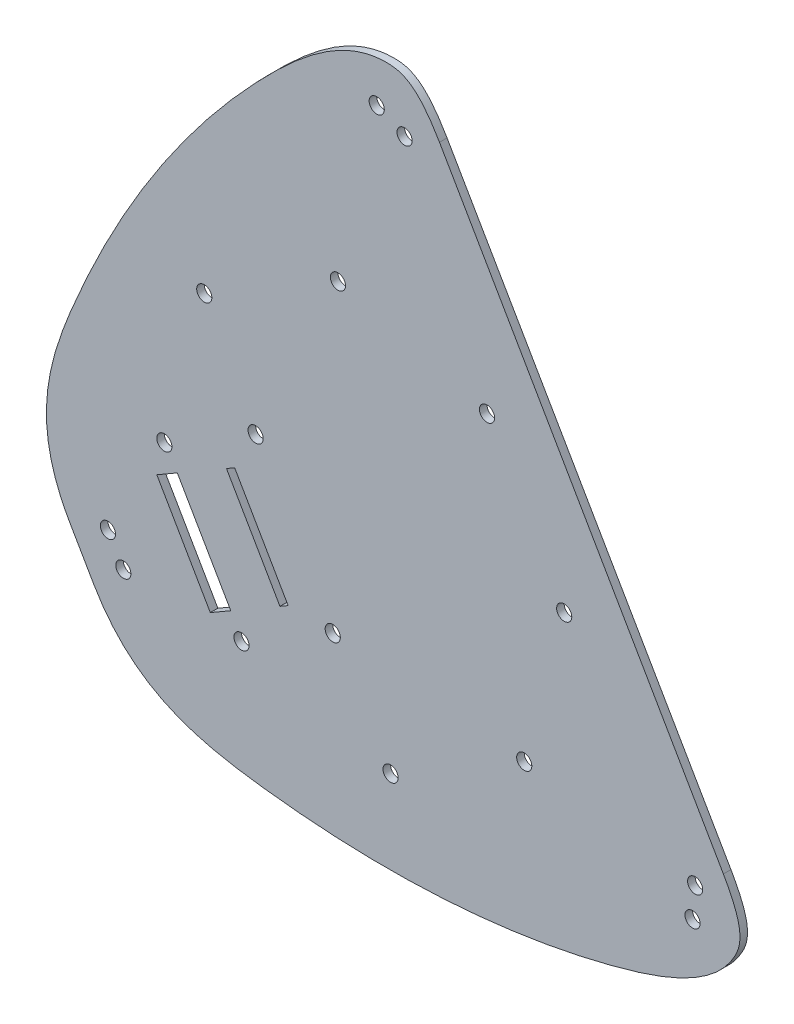
ISO-10303-21;
HEADER;
FILE_DESCRIPTION(('STEP AP214'),'2;1');
FILE_NAME('part.step','',(''),(''),'','','');
FILE_SCHEMA(('AUTOMOTIVE_DESIGN { 1 0 10303 214 1 1 1 1 }'));
ENDSEC;
DATA;
#1=APPLICATION_CONTEXT('core data for automotive mechanical design processes');
#2=APPLICATION_PROTOCOL_DEFINITION('international standard','automotive_design',2000,#1);
#3=PRODUCT_CONTEXT('',#1,'mechanical');
#4=PRODUCT('Part','Part','',(#3));
#5=PRODUCT_RELATED_PRODUCT_CATEGORY('part','',(#4));
#6=PRODUCT_DEFINITION_FORMATION('','',#4);
#7=PRODUCT_DEFINITION_CONTEXT('part definition',#1,'design');
#8=PRODUCT_DEFINITION('design','',#6,#7);
#9=PRODUCT_DEFINITION_SHAPE('','',#8);
#10=(LENGTH_UNIT() NAMED_UNIT(*) SI_UNIT(.MILLI.,.METRE.));
#11=(NAMED_UNIT(*) PLANE_ANGLE_UNIT() SI_UNIT($,.RADIAN.));
#12=(NAMED_UNIT(*) SI_UNIT($,.STERADIAN.) SOLID_ANGLE_UNIT());
#13=UNCERTAINTY_MEASURE_WITH_UNIT(LENGTH_MEASURE(1.E-05),#10,'distance_accuracy_value','');
#14=(GEOMETRIC_REPRESENTATION_CONTEXT(3) GLOBAL_UNCERTAINTY_ASSIGNED_CONTEXT((#13)) GLOBAL_UNIT_ASSIGNED_CONTEXT((#10,
#11,#12)) REPRESENTATION_CONTEXT('',''));
#15=CARTESIAN_POINT('',(0.,0.,0.));
#16=DIRECTION('',(0.,0.,1.));
#17=DIRECTION('',(1.,0.,0.));
#18=AXIS2_PLACEMENT_3D('',#15,#16,#17);
#19=CARTESIAN_POINT('',(-72.5135977928275,27.52250719282,1.6));
#20=DIRECTION('',(0.,0.,-1.));
#21=DIRECTION('',(-1.,0.,0.));
#22=AXIS2_PLACEMENT_3D('',#19,#20,#21);
#23=PLANE('',#22);
#24=CARTESIAN_POINT('',(-36.1038981333848,-39.6662140816864,1.6));
#25=DIRECTION('',(0.,0.,-1.));
#26=DIRECTION('',(-1.,0.,0.));
#27=AXIS2_PLACEMENT_3D('',#24,#25,#26);
#28=CIRCLE('',#27,1.60000000000001);
#29=CARTESIAN_POINT('',(-37.7038981333848,-39.6662140816864,1.6));
#30=VERTEX_POINT('',#29);
#31=EDGE_CURVE('E421',#30,#30,#28,.T.);
#32=ORIENTED_EDGE('',*,*,#31,.T.);
#33=EDGE_LOOP('',(#32));
#34=FACE_BOUND('',#33,.T.);
#35=CARTESIAN_POINT('',(-52.4038981333848,-11.4337859183136,1.6));
#36=DIRECTION('',(0.,0.,-1.));
#37=DIRECTION('',(-1.,0.,0.));
#38=AXIS2_PLACEMENT_3D('',#35,#36,#37);
#39=CIRCLE('',#38,1.6);
#40=CARTESIAN_POINT('',(-54.0038981333848,-11.4337859183136,1.6));
#41=VERTEX_POINT('',#40);
#42=EDGE_CURVE('E426',#41,#41,#39,.T.);
#43=ORIENTED_EDGE('',*,*,#42,.T.);
#44=EDGE_LOOP('',(#43));
#45=FACE_BOUND('',#44,.T.);
#46=DIRECTION('',(-0.866025403784438,-0.500000000000001,0.));
#47=VECTOR('',#46,1.);
#48=CARTESIAN_POINT('',(-61.9865840355647,-48.8360870627642,1.6));
#49=LINE('',#48,#47);
#50=CARTESIAN_POINT('',(-57.6564570166425,-46.3360870627642,1.6));
#51=VERTEX_POINT('',#50);
#52=CARTESIAN_POINT('',(-61.9865840355647,-48.8360870627642,1.6));
#53=VERTEX_POINT('',#52);
#54=EDGE_CURVE('E167',#51,#53,#49,.T.);
#55=ORIENTED_EDGE('',*,*,#54,.T.);
#56=DIRECTION('',(-0.5,0.866025403784439,0.));
#57=VECTOR('',#56,1.);
#58=CARTESIAN_POINT('',(-73.2865840355647,-29.2639129372359,1.6));
#59=LINE('',#58,#57);
#60=CARTESIAN_POINT('',(-73.2865840355647,-29.2639129372359,1.6));
#61=VERTEX_POINT('',#60);
#62=EDGE_CURVE('E190',#53,#61,#59,.T.);
#63=ORIENTED_EDGE('',*,*,#62,.T.);
#64=DIRECTION('',(0.866025403784438,0.5,0.));
#65=VECTOR('',#64,1.);
#66=CARTESIAN_POINT('',(-68.9564570166425,-26.7639129372359,1.6));
#67=LINE('',#66,#65);
#68=CARTESIAN_POINT('',(-68.9564570166425,-26.7639129372359,1.6));
#69=VERTEX_POINT('',#68);
#70=EDGE_CURVE('E132',#61,#69,#67,.T.);
#71=ORIENTED_EDGE('',*,*,#70,.T.);
#72=DIRECTION('',(0.5,-0.866025403784439,0.));
#73=VECTOR('',#72,1.);
#74=CARTESIAN_POINT('',(-57.6564570166425,-46.3360870627642,1.6));
#75=LINE('',#74,#73);
#76=EDGE_CURVE('E164',#69,#51,#75,.T.);
#77=ORIENTED_EDGE('',*,*,#76,.T.);
#78=EDGE_LOOP('',(#55,#63,#71,#77));
#79=FACE_BOUND('',#78,.T.);
#80=CARTESIAN_POINT('',(-23.8818374162525,-59.2553799917519,1.6));
#81=DIRECTION('',(0.,0.,-1.));
#82=DIRECTION('',(-1.,0.,0.));
#83=AXIS2_PLACEMENT_3D('',#80,#81,#82);
#84=CIRCLE('',#83,1.6);
#85=CARTESIAN_POINT('',(-25.4818374162525,-59.2553799917519,1.6));
#86=VERTEX_POINT('',#85);
#87=EDGE_CURVE('E216',#86,#86,#84,.T.);
#88=ORIENTED_EDGE('',*,*,#87,.T.);
#89=EDGE_LOOP('',(#88));
#90=FACE_BOUND('',#89,.T.);
#91=CARTESIAN_POINT('',(-71.700243720423,-22.5630263124186,1.6));
#92=DIRECTION('',(0.,0.,-1.));
#93=DIRECTION('',(-1.,0.,0.));
#94=AXIS2_PLACEMENT_3D('',#91,#92,#93);
#95=CIRCLE('',#94,1.6);
#96=CARTESIAN_POINT('',(-73.300243720423,-22.5630263124186,1.6));
#97=VERTEX_POINT('',#96);
#98=EDGE_CURVE('E222',#97,#97,#95,.T.);
#99=ORIENTED_EDGE('',*,*,#98,.T.);
#100=EDGE_LOOP('',(#99));
#101=FACE_BOUND('',#100,.T.);
#102=CARTESIAN_POINT('',(-63.2575830918835,8.94541210435178,1.6));
#103=DIRECTION('',(0.,0.,-1.));
#104=DIRECTION('',(-1.,0.,0.));
#105=AXIS2_PLACEMENT_3D('',#102,#103,#104);
#106=CIRCLE('',#105,1.6);
#107=CARTESIAN_POINT('',(-64.8575830918836,8.94541210435178,1.6));
#108=VERTEX_POINT('',#107);
#109=EDGE_CURVE('E228',#108,#108,#106,.T.);
#110=ORIENTED_EDGE('',*,*,#109,.T.);
#111=EDGE_LOOP('',(#110));
#112=FACE_BOUND('',#111,.T.);
#113=CARTESIAN_POINT('',(-3.49945162431928,16.8127193632125,1.6));
#114=DIRECTION('',(0.,0.,-1.));
#115=DIRECTION('',(-1.,0.,0.));
#116=AXIS2_PLACEMENT_3D('',#113,#114,#115);
#117=CIRCLE('',#116,1.6);
#118=CARTESIAN_POINT('',(-5.09945162431928,16.8127193632125,1.6));
#119=VERTEX_POINT('',#118);
#120=EDGE_CURVE('E197',#119,#119,#117,.T.);
#121=ORIENTED_EDGE('',*,*,#120,.T.);
#122=EDGE_LOOP('',(#121));
#123=FACE_BOUND('',#122,.T.);
#124=CARTESIAN_POINT('',(-35.0078900410896,25.2553799917519,1.6));
#125=DIRECTION('',(0.,0.,-1.));
#126=DIRECTION('',(-1.,0.,0.));
#127=AXIS2_PLACEMENT_3D('',#124,#125,#126);
#128=CIRCLE('',#127,1.6);
#129=CARTESIAN_POINT('',(-36.6078900410896,25.2553799917519,1.6));
#130=VERTEX_POINT('',#129);
#131=EDGE_CURVE('E198',#130,#130,#128,.T.);
#132=ORIENTED_EDGE('',*,*,#131,.T.);
#133=EDGE_LOOP('',(#132));
#134=FACE_BOUND('',#133,.T.);
#135=CARTESIAN_POINT('',(12.8105162630809,-11.4369736875814,1.6));
#136=DIRECTION('',(0.,0.,-1.));
#137=DIRECTION('',(-1.,0.,0.));
#138=AXIS2_PLACEMENT_3D('',#135,#136,#137);
#139=CIRCLE('',#138,1.6);
#140=CARTESIAN_POINT('',(11.2105162630809,-11.4369736875814,1.6));
#141=VERTEX_POINT('',#140);
#142=EDGE_CURVE('E204',#141,#141,#139,.T.);
#143=ORIENTED_EDGE('',*,*,#142,.T.);
#144=EDGE_LOOP('',(#143));
#145=FACE_BOUND('',#144,.T.);
#146=CARTESIAN_POINT('',(4.36785563454145,-42.9454121043518,1.6));
#147=DIRECTION('',(0.,0.,-1.));
#148=DIRECTION('',(-1.,0.,0.));
#149=AXIS2_PLACEMENT_3D('',#146,#147,#148);
#150=CIRCLE('',#149,1.60000000000001);
#151=CARTESIAN_POINT('',(2.76785563454144,-42.9454121043518,1.6));
#152=VERTEX_POINT('',#151);
#153=EDGE_CURVE('E193',#152,#152,#150,.T.);
#154=ORIENTED_EDGE('',*,*,#153,.T.);
#155=EDGE_LOOP('',(#154));
#156=FACE_BOUND('',#155,.T.);
#157=CARTESIAN_POINT('',(-55.3902758330228,-50.8127193632125,1.6));
#158=DIRECTION('',(0.,0.,-1.));
#159=DIRECTION('',(-1.,0.,0.));
#160=AXIS2_PLACEMENT_3D('',#157,#158,#159);
#161=CIRCLE('',#160,1.6);
#162=CARTESIAN_POINT('',(-56.9902758330228,-50.8127193632125,1.6));
#163=VERTEX_POINT('',#162);
#164=EDGE_CURVE('E215',#163,#163,#161,.T.);
#165=ORIENTED_EDGE('',*,*,#164,.T.);
#166=EDGE_LOOP('',(#165));
#167=FACE_BOUND('',#166,.T.);
#168=CARTESIAN_POINT('',(-13.5455173280958,61.4615242270663,1.6));
#169=CARTESIAN_POINT('',(-18.1034978631436,69.3561780936791,1.6));
#170=CARTESIAN_POINT('',(-30.3460929124978,73.3651733110255,1.6));
#171=CARTESIAN_POINT('',(-62.0170224978814,46.6032172191468,1.6));
#172=CARTESIAN_POINT('',(-88.780367640564,3.65215406113238,1.6));
#173=CARTESIAN_POINT('',(-100.266401629773,-32.3334980851261,1.6));
#174=CARTESIAN_POINT('',(-91.7401131303767,-47.1014629660708,1.6));
#175=B_SPLINE_CURVE_WITH_KNOTS('',3,(#168,#169,#170,#171,#172,#173,#174),.UNSPECIFIED.,.F.,.F.,
(4,1,1,1,4),(0.,0.0739990040143119,0.286658719787785,0.740794666502256,1.),.UNSPECIFIED.);
#176=CARTESIAN_POINT('',(-13.5455173280958,61.4615242270663,1.6));
#177=VERTEX_POINT('',#176);
#178=CARTESIAN_POINT('',(-91.7401131303769,-47.1014629660706,1.6));
#179=VERTEX_POINT('',#178);
#180=EDGE_CURVE('E277',#177,#179,#175,.T.);
#181=ORIENTED_EDGE('',*,*,#180,.T.);
#182=DIRECTION('',(0.500000000000001,-0.866025403784438,0.));
#183=VECTOR('',#182,1.);
#184=CARTESIAN_POINT('',(-91.7401131303769,-47.1014629660706,1.6));
#185=LINE('',#184,#183);
#186=CARTESIAN_POINT('',(-86.6611200492175,-55.8985370339294,1.6));
#187=VERTEX_POINT('',#186);
#188=EDGE_CURVE('E283',#179,#187,#185,.T.);
#189=ORIENTED_EDGE('',*,*,#188,.T.);
#190=CARTESIAN_POINT('',(-86.6611200492175,-55.8985370339294,1.6));
#191=CARTESIAN_POINT('',(-78.1348315498211,-70.6665019148742,1.6));
#192=CARTESIAN_POINT('',(-41.2273256248066,-78.7121307646167,1.6));
#193=CARTESIAN_POINT('',(9.35105876092504,-77.0099255598097,1.6));
#194=CARTESIAN_POINT('',(48.3630573841475,-62.9630740233386,1.6));
#195=CARTESIAN_POINT('',(51.0124632069523,-50.3561780936791,1.6));
#196=CARTESIAN_POINT('',(46.4544826719044,-42.4615242270663,1.6));
#197=B_SPLINE_CURVE_WITH_KNOTS('',3,(#190,#191,#192,#193,#194,#195,#196),.UNSPECIFIED.,.F.,.F.,
(4,1,1,1,4),(0.,0.259205333497744,0.713341280212215,0.926000995985688,1.),.UNSPECIFIED.);
#198=CARTESIAN_POINT('',(46.4544826719044,-42.4615242270663,1.6));
#199=VERTEX_POINT('',#198);
#200=EDGE_CURVE('E289',#187,#199,#197,.T.);
#201=ORIENTED_EDGE('',*,*,#200,.T.);
#202=DIRECTION('',(-0.500000000000001,0.866025403784438,0.));
#203=VECTOR('',#202,1.);
#204=CARTESIAN_POINT('',(-13.5455173280958,61.4615242270663,1.6));
#205=LINE('',#204,#203);
#206=EDGE_CURVE('E294',#199,#177,#205,.T.);
#207=ORIENTED_EDGE('',*,*,#206,.T.);
#208=EDGE_LOOP('',(#181,#189,#201,#207));
#209=FACE_BOUND('',#208,.T.);
#210=CARTESIAN_POINT('',(-26.8116746345107,61.5908955523572,1.6));
#211=DIRECTION('',(0.,0.,1.));
#212=DIRECTION('',(1.,0.,0.));
#213=AXIS2_PLACEMENT_3D('',#210,#211,#212);
#214=CIRCLE('',#213,1.6);
#215=CARTESIAN_POINT('',(-25.2116746345107,61.5908955523572,1.6));
#216=VERTEX_POINT('',#215);
#217=EDGE_CURVE('E272',#216,#216,#214,.T.);
#218=ORIENTED_EDGE('',*,*,#217,.F.);
#219=EDGE_LOOP('',(#218));
#220=FACE_BOUND('',#219,.T.);
#221=CARTESIAN_POINT('',(-20.9258374783027,58.8328308376339,1.6));
#222=DIRECTION('',(0.,0.,1.));
#223=DIRECTION('',(1.,0.,0.));
#224=AXIS2_PLACEMENT_3D('',#221,#222,#223);
#225=CIRCLE('',#224,1.6);
#226=CARTESIAN_POINT('',(-19.3258374783027,58.8328308376339,1.6));
#227=VERTEX_POINT('',#226);
#228=EDGE_CURVE('E266',#227,#227,#225,.T.);
#229=ORIENTED_EDGE('',*,*,#228,.F.);
#230=EDGE_LOOP('',(#229));
#231=FACE_BOUND('',#230,.T.);
#232=CARTESIAN_POINT('',(-83.6171346723259,-44.523598462199,1.6));
#233=DIRECTION('',(0.,0.,1.));
#234=DIRECTION('',(1.,0.,0.));
#235=AXIS2_PLACEMENT_3D('',#232,#233,#234);
#236=CIRCLE('',#235,1.60000000000001);
#237=CARTESIAN_POINT('',(-82.0171346723259,-44.523598462199,1.6));
#238=VERTEX_POINT('',#237);
#239=EDGE_CURVE('E260',#238,#238,#236,.T.);
#240=ORIENTED_EDGE('',*,*,#239,.F.);
#241=EDGE_LOOP('',(#240));
#242=FACE_BOUND('',#241,.T.);
#243=CARTESIAN_POINT('',(-80.3671346723259,-50.1527635867979,1.6));
#244=DIRECTION('',(0.,0.,1.));
#245=DIRECTION('',(1.,0.,0.));
#246=AXIS2_PLACEMENT_3D('',#243,#244,#245);
#247=CIRCLE('',#246,1.60000000000001);
#248=CARTESIAN_POINT('',(-78.7671346723259,-50.1527635867979,1.6));
#249=VERTEX_POINT('',#248);
#250=EDGE_CURVE('E254',#249,#249,#247,.T.);
#251=ORIENTED_EDGE('',*,*,#250,.F.);
#252=EDGE_LOOP('',(#251));
#253=FACE_BOUND('',#252,.T.);
#254=CARTESIAN_POINT('',(40.4878073427909,-47.538722270494,1.6));
#255=DIRECTION('',(0.,0.,1.));
#256=DIRECTION('',(1.,0.,0.));
#257=AXIS2_PLACEMENT_3D('',#254,#255,#256);
#258=CIRCLE('',#257,1.6);
#259=CARTESIAN_POINT('',(42.0878073427909,-47.538722270494,1.6));
#260=VERTEX_POINT('',#259);
#261=EDGE_CURVE('E248',#260,#260,#258,.T.);
#262=ORIENTED_EDGE('',*,*,#261,.F.);
#263=EDGE_LOOP('',(#262));
#264=FACE_BOUND('',#263,.T.);
#265=CARTESIAN_POINT('',(39.933442872919,-54.0150391276701,1.6));
#266=DIRECTION('',(0.,0.,1.));
#267=DIRECTION('',(1.,0.,0.));
#268=AXIS2_PLACEMENT_3D('',#265,#266,#267);
#269=CIRCLE('',#268,1.6);
#270=CARTESIAN_POINT('',(41.533442872919,-54.0150391276701,1.6));
#271=VERTEX_POINT('',#270);
#272=EDGE_CURVE('E242',#271,#271,#269,.T.);
#273=ORIENTED_EDGE('',*,*,#272,.F.);
#274=EDGE_LOOP('',(#273));
#275=FACE_BOUND('',#274,.T.);
#276=DIRECTION('',(0.5,-0.866025403784439,0.));
#277=VECTOR('',#276,1.);
#278=CARTESIAN_POINT('',(-45.5321013636603,-39.3360870627642,1.6));
#279=LINE('',#278,#277);
#280=CARTESIAN_POINT('',(-56.8321013636603,-19.7639129372359,1.6));
#281=VERTEX_POINT('',#280);
#282=CARTESIAN_POINT('',(-45.5321013636603,-39.3360870627642,1.6));
#283=VERTEX_POINT('',#282);
#284=EDGE_CURVE('E137',#281,#283,#279,.T.);
#285=ORIENTED_EDGE('',*,*,#284,.T.);
#286=DIRECTION('',(-0.866025403784439,-0.499999999999999,0.));
#287=VECTOR('',#286,1.);
#288=CARTESIAN_POINT('',(-47.2641521712292,-40.3360870627642,1.6));
#289=LINE('',#288,#287);
#290=CARTESIAN_POINT('',(-47.2641521712292,-40.3360870627642,1.6));
#291=VERTEX_POINT('',#290);
#292=EDGE_CURVE('E124',#283,#291,#289,.T.);
#293=ORIENTED_EDGE('',*,*,#292,.T.);
#294=DIRECTION('',(-0.5,0.866025403784439,0.));
#295=VECTOR('',#294,1.);
#296=CARTESIAN_POINT('',(-58.5641521712292,-20.7639129372359,1.6));
#297=LINE('',#296,#295);
#298=CARTESIAN_POINT('',(-58.5641521712292,-20.7639129372359,1.6));
#299=VERTEX_POINT('',#298);
#300=EDGE_CURVE('E148',#291,#299,#297,.T.);
#301=ORIENTED_EDGE('',*,*,#300,.T.);
#302=DIRECTION('',(0.866025403784439,0.5,0.));
#303=VECTOR('',#302,1.);
#304=CARTESIAN_POINT('',(-56.8321013636603,-19.7639129372359,1.6));
#305=LINE('',#304,#303);
#306=EDGE_CURVE('E144',#299,#281,#305,.T.);
#307=ORIENTED_EDGE('',*,*,#306,.T.);
#308=EDGE_LOOP('',(#285,#293,#301,#307));
#309=FACE_BOUND('',#308,.T.);
#310=ADVANCED_FACE('F35',(#34,#45,#79,#90,#101,#112,#123,#134,#145,#156,#167,#209,#220,#231,
#242,#253,#264,#275,#309),#23,.F.);
#311=CARTESIAN_POINT('',(-72.5135977928275,27.52250719282,0.));
#312=DIRECTION('',(0.,0.,-1.));
#313=DIRECTION('',(-1.,0.,0.));
#314=AXIS2_PLACEMENT_3D('',#311,#312,#313);
#315=PLANE('',#314);
#316=CARTESIAN_POINT('',(-36.1038981333848,-39.6662140816864,0.));
#317=DIRECTION('',(0.,0.,1.));
#318=DIRECTION('',(1.,0.,0.));
#319=AXIS2_PLACEMENT_3D('',#316,#317,#318);
#320=CIRCLE('',#319,1.60000000000001);
#321=CARTESIAN_POINT('',(-34.5038981333848,-39.6662140816864,0.));
#322=VERTEX_POINT('',#321);
#323=EDGE_CURVE('E419',#322,#322,#320,.T.);
#324=ORIENTED_EDGE('',*,*,#323,.T.);
#325=EDGE_LOOP('',(#324));
#326=FACE_BOUND('',#325,.T.);
#327=CARTESIAN_POINT('',(-52.4038981333848,-11.4337859183136,0.));
#328=DIRECTION('',(0.,0.,1.));
#329=DIRECTION('',(1.,0.,0.));
#330=AXIS2_PLACEMENT_3D('',#327,#328,#329);
#331=CIRCLE('',#330,1.6);
#332=CARTESIAN_POINT('',(-50.8038981333848,-11.4337859183136,0.));
#333=VERTEX_POINT('',#332);
#334=EDGE_CURVE('E422',#333,#333,#331,.T.);
#335=ORIENTED_EDGE('',*,*,#334,.T.);
#336=EDGE_LOOP('',(#335));
#337=FACE_BOUND('',#336,.T.);
#338=CARTESIAN_POINT('',(-23.8818374162525,-59.2553799917519,0.));
#339=DIRECTION('',(0.,0.,1.));
#340=DIRECTION('',(1.,0.,0.));
#341=AXIS2_PLACEMENT_3D('',#338,#339,#340);
#342=CIRCLE('',#341,1.6);
#343=CARTESIAN_POINT('',(-22.2818374162525,-59.2553799917519,0.));
#344=VERTEX_POINT('',#343);
#345=EDGE_CURVE('E212',#344,#344,#342,.T.);
#346=ORIENTED_EDGE('',*,*,#345,.T.);
#347=EDGE_LOOP('',(#346));
#348=FACE_BOUND('',#347,.T.);
#349=CARTESIAN_POINT('',(-71.700243720423,-22.5630263124186,0.));
#350=DIRECTION('',(0.,0.,1.));
#351=DIRECTION('',(1.,0.,0.));
#352=AXIS2_PLACEMENT_3D('',#349,#350,#351);
#353=CIRCLE('',#352,1.6);
#354=CARTESIAN_POINT('',(-70.100243720423,-22.5630263124186,0.));
#355=VERTEX_POINT('',#354);
#356=EDGE_CURVE('E219',#355,#355,#353,.T.);
#357=ORIENTED_EDGE('',*,*,#356,.T.);
#358=EDGE_LOOP('',(#357));
#359=FACE_BOUND('',#358,.T.);
#360=CARTESIAN_POINT('',(-63.2575830918835,8.94541210435178,0.));
#361=DIRECTION('',(0.,0.,1.));
#362=DIRECTION('',(1.,0.,0.));
#363=AXIS2_PLACEMENT_3D('',#360,#361,#362);
#364=CIRCLE('',#363,1.6);
#365=CARTESIAN_POINT('',(-61.6575830918835,8.94541210435178,0.));
#366=VERTEX_POINT('',#365);
#367=EDGE_CURVE('E225',#366,#366,#364,.T.);
#368=ORIENTED_EDGE('',*,*,#367,.T.);
#369=EDGE_LOOP('',(#368));
#370=FACE_BOUND('',#369,.T.);
#371=CARTESIAN_POINT('',(-3.49945162431928,16.8127193632125,0.));
#372=DIRECTION('',(0.,0.,1.));
#373=DIRECTION('',(1.,0.,0.));
#374=AXIS2_PLACEMENT_3D('',#371,#372,#373);
#375=CIRCLE('',#374,1.6);
#376=CARTESIAN_POINT('',(-1.89945162431928,16.8127193632125,0.));
#377=VERTEX_POINT('',#376);
#378=EDGE_CURVE('E231',#377,#377,#375,.T.);
#379=ORIENTED_EDGE('',*,*,#378,.T.);
#380=EDGE_LOOP('',(#379));
#381=FACE_BOUND('',#380,.T.);
#382=CARTESIAN_POINT('',(-35.0078900410896,25.2553799917519,0.));
#383=DIRECTION('',(0.,0.,1.));
#384=DIRECTION('',(1.,0.,0.));
#385=AXIS2_PLACEMENT_3D('',#382,#383,#384);
#386=CIRCLE('',#385,1.6);
#387=CARTESIAN_POINT('',(-33.4078900410896,25.2553799917519,0.));
#388=VERTEX_POINT('',#387);
#389=EDGE_CURVE('E194',#388,#388,#386,.T.);
#390=ORIENTED_EDGE('',*,*,#389,.T.);
#391=EDGE_LOOP('',(#390));
#392=FACE_BOUND('',#391,.T.);
#393=CARTESIAN_POINT('',(12.8105162630809,-11.4369736875814,0.));
#394=DIRECTION('',(0.,0.,1.));
#395=DIRECTION('',(1.,0.,0.));
#396=AXIS2_PLACEMENT_3D('',#393,#394,#395);
#397=CIRCLE('',#396,1.6);
#398=CARTESIAN_POINT('',(14.4105162630809,-11.4369736875814,0.));
#399=VERTEX_POINT('',#398);
#400=EDGE_CURVE('E201',#399,#399,#397,.T.);
#401=ORIENTED_EDGE('',*,*,#400,.T.);
#402=EDGE_LOOP('',(#401));
#403=FACE_BOUND('',#402,.T.);
#404=CARTESIAN_POINT('',(4.36785563454145,-42.9454121043518,0.));
#405=DIRECTION('',(0.,0.,1.));
#406=DIRECTION('',(1.,0.,0.));
#407=AXIS2_PLACEMENT_3D('',#404,#405,#406);
#408=CIRCLE('',#407,1.60000000000001);
#409=CARTESIAN_POINT('',(5.96785563454145,-42.9454121043518,0.));
#410=VERTEX_POINT('',#409);
#411=EDGE_CURVE('E207',#410,#410,#408,.T.);
#412=ORIENTED_EDGE('',*,*,#411,.T.);
#413=EDGE_LOOP('',(#412));
#414=FACE_BOUND('',#413,.T.);
#415=CARTESIAN_POINT('',(-55.3902758330228,-50.8127193632125,0.));
#416=DIRECTION('',(0.,0.,1.));
#417=DIRECTION('',(1.,0.,0.));
#418=AXIS2_PLACEMENT_3D('',#415,#416,#417);
#419=CIRCLE('',#418,1.6);
#420=CARTESIAN_POINT('',(-53.7902758330228,-50.8127193632125,0.));
#421=VERTEX_POINT('',#420);
#422=EDGE_CURVE('E236',#421,#421,#419,.T.);
#423=ORIENTED_EDGE('',*,*,#422,.T.);
#424=EDGE_LOOP('',(#423));
#425=FACE_BOUND('',#424,.T.);
#426=CARTESIAN_POINT('',(40.4878073427909,-47.538722270494,0.));
#427=DIRECTION('',(0.,0.,1.));
#428=DIRECTION('',(1.,0.,0.));
#429=AXIS2_PLACEMENT_3D('',#426,#427,#428);
#430=CIRCLE('',#429,1.6);
#431=CARTESIAN_POINT('',(42.0878073427909,-47.538722270494,0.));
#432=VERTEX_POINT('',#431);
#433=EDGE_CURVE('E245',#432,#432,#430,.T.);
#434=ORIENTED_EDGE('',*,*,#433,.T.);
#435=EDGE_LOOP('',(#434));
#436=FACE_BOUND('',#435,.T.);
#437=CARTESIAN_POINT('',(-83.6171346723259,-44.523598462199,0.));
#438=DIRECTION('',(0.,0.,1.));
#439=DIRECTION('',(1.,0.,0.));
#440=AXIS2_PLACEMENT_3D('',#437,#438,#439);
#441=CIRCLE('',#440,1.60000000000001);
#442=CARTESIAN_POINT('',(-82.0171346723259,-44.523598462199,0.));
#443=VERTEX_POINT('',#442);
#444=EDGE_CURVE('E257',#443,#443,#441,.T.);
#445=ORIENTED_EDGE('',*,*,#444,.T.);
#446=EDGE_LOOP('',(#445));
#447=FACE_BOUND('',#446,.T.);
#448=CARTESIAN_POINT('',(-26.8116746345107,61.5908955523572,0.));
#449=DIRECTION('',(0.,0.,1.));
#450=DIRECTION('',(1.,0.,0.));
#451=AXIS2_PLACEMENT_3D('',#448,#449,#450);
#452=CIRCLE('',#451,1.6);
#453=CARTESIAN_POINT('',(-25.2116746345107,61.5908955523572,0.));
#454=VERTEX_POINT('',#453);
#455=EDGE_CURVE('E269',#454,#454,#452,.T.);
#456=ORIENTED_EDGE('',*,*,#455,.T.);
#457=EDGE_LOOP('',(#456));
#458=FACE_BOUND('',#457,.T.);
#459=CARTESIAN_POINT('',(-13.5455173280958,61.4615242270663,0.));
#460=CARTESIAN_POINT('',(-18.1034978631436,69.3561780936791,0.));
#461=CARTESIAN_POINT('',(-30.3460929124978,73.3651733110255,0.));
#462=CARTESIAN_POINT('',(-62.0170224978814,46.6032172191468,0.));
#463=CARTESIAN_POINT('',(-88.780367640564,3.65215406113238,0.));
#464=CARTESIAN_POINT('',(-100.266401629773,-32.3334980851261,0.));
#465=CARTESIAN_POINT('',(-91.7401131303767,-47.1014629660708,0.));
#466=B_SPLINE_CURVE_WITH_KNOTS('',3,(#459,#460,#461,#462,#463,#464,#465),.UNSPECIFIED.,.F.,.F.,
(4,1,1,1,4),(0.,0.0739990040143119,0.286658719787785,0.740794666502256,1.),.UNSPECIFIED.);
#467=CARTESIAN_POINT('',(-13.5455173280958,61.4615242270663,0.));
#468=VERTEX_POINT('',#467);
#469=CARTESIAN_POINT('',(-91.7401131303769,-47.1014629660706,0.));
#470=VERTEX_POINT('',#469);
#471=EDGE_CURVE('E275',#468,#470,#466,.T.);
#472=ORIENTED_EDGE('',*,*,#471,.F.);
#473=DIRECTION('',(-0.500000000000001,0.866025403784438,0.));
#474=VECTOR('',#473,1.);
#475=CARTESIAN_POINT('',(-13.5455173280958,61.4615242270663,0.));
#476=LINE('',#475,#474);
#477=CARTESIAN_POINT('',(46.4544826719044,-42.4615242270663,0.));
#478=VERTEX_POINT('',#477);
#479=EDGE_CURVE('E284',#478,#468,#476,.T.);
#480=ORIENTED_EDGE('',*,*,#479,.F.);
#481=CARTESIAN_POINT('',(-86.6611200492175,-55.8985370339294,0.));
#482=CARTESIAN_POINT('',(-78.1348315498211,-70.6665019148742,0.));
#483=CARTESIAN_POINT('',(-41.2273256248066,-78.7121307646167,0.));
#484=CARTESIAN_POINT('',(9.35105876092504,-77.0099255598097,0.));
#485=CARTESIAN_POINT('',(48.3630573841475,-62.9630740233386,0.));
#486=CARTESIAN_POINT('',(51.0124632069523,-50.3561780936791,0.));
#487=CARTESIAN_POINT('',(46.4544826719044,-42.4615242270663,0.));
#488=B_SPLINE_CURVE_WITH_KNOTS('',3,(#481,#482,#483,#484,#485,#486,#487),.UNSPECIFIED.,.F.,.F.,
(4,1,1,1,4),(0.,0.259205333497744,0.713341280212215,0.926000995985688,1.),.UNSPECIFIED.);
#489=CARTESIAN_POINT('',(-86.6611200492175,-55.8985370339294,0.));
#490=VERTEX_POINT('',#489);
#491=EDGE_CURVE('E497',#490,#478,#488,.T.);
#492=ORIENTED_EDGE('',*,*,#491,.F.);
#493=DIRECTION('',(0.500000000000001,-0.866025403784438,0.));
#494=VECTOR('',#493,1.);
#495=CARTESIAN_POINT('',(-91.7401131303769,-47.1014629660706,0.));
#496=LINE('',#495,#494);
#497=EDGE_CURVE('E495',#470,#490,#496,.T.);
#498=ORIENTED_EDGE('',*,*,#497,.F.);
#499=EDGE_LOOP('',(#472,#480,#492,#498));
#500=FACE_BOUND('',#499,.T.);
#501=CARTESIAN_POINT('',(-20.9258374783027,58.8328308376339,0.));
#502=DIRECTION('',(0.,0.,1.));
#503=DIRECTION('',(1.,0.,0.));
#504=AXIS2_PLACEMENT_3D('',#501,#502,#503);
#505=CIRCLE('',#504,1.6);
#506=CARTESIAN_POINT('',(-19.3258374783027,58.8328308376339,0.));
#507=VERTEX_POINT('',#506);
#508=EDGE_CURVE('E263',#507,#507,#505,.T.);
#509=ORIENTED_EDGE('',*,*,#508,.T.);
#510=EDGE_LOOP('',(#509));
#511=FACE_BOUND('',#510,.T.);
#512=CARTESIAN_POINT('',(-80.3671346723259,-50.1527635867979,0.));
#513=DIRECTION('',(0.,0.,1.));
#514=DIRECTION('',(1.,0.,0.));
#515=AXIS2_PLACEMENT_3D('',#512,#513,#514);
#516=CIRCLE('',#515,1.60000000000001);
#517=CARTESIAN_POINT('',(-78.7671346723259,-50.1527635867979,0.));
#518=VERTEX_POINT('',#517);
#519=EDGE_CURVE('E251',#518,#518,#516,.T.);
#520=ORIENTED_EDGE('',*,*,#519,.T.);
#521=EDGE_LOOP('',(#520));
#522=FACE_BOUND('',#521,.T.);
#523=CARTESIAN_POINT('',(39.933442872919,-54.0150391276701,0.));
#524=DIRECTION('',(0.,0.,1.));
#525=DIRECTION('',(1.,0.,0.));
#526=AXIS2_PLACEMENT_3D('',#523,#524,#525);
#527=CIRCLE('',#526,1.6);
#528=CARTESIAN_POINT('',(41.533442872919,-54.0150391276701,0.));
#529=VERTEX_POINT('',#528);
#530=EDGE_CURVE('E239',#529,#529,#527,.T.);
#531=ORIENTED_EDGE('',*,*,#530,.T.);
#532=EDGE_LOOP('',(#531));
#533=FACE_BOUND('',#532,.T.);
#534=DIRECTION('',(0.5,-0.866025403784438,0.));
#535=VECTOR('',#534,1.);
#536=CARTESIAN_POINT('',(-73.2865840355647,-29.2639129372359,0.));
#537=LINE('',#536,#535);
#538=CARTESIAN_POINT('',(-73.2865840355647,-29.2639129372359,0.));
#539=VERTEX_POINT('',#538);
#540=CARTESIAN_POINT('',(-61.9865840355647,-48.8360870627642,0.));
#541=VERTEX_POINT('',#540);
#542=EDGE_CURVE('E179',#539,#541,#537,.T.);
#543=ORIENTED_EDGE('',*,*,#542,.T.);
#544=DIRECTION('',(0.866025403784438,0.500000000000001,0.));
#545=VECTOR('',#544,1.);
#546=CARTESIAN_POINT('',(-61.9865840355647,-48.8360870627642,0.));
#547=LINE('',#546,#545);
#548=CARTESIAN_POINT('',(-57.6564570166425,-46.3360870627642,0.));
#549=VERTEX_POINT('',#548);
#550=EDGE_CURVE('E170',#541,#549,#547,.T.);
#551=ORIENTED_EDGE('',*,*,#550,.T.);
#552=DIRECTION('',(-0.5,0.866025403784438,0.));
#553=VECTOR('',#552,1.);
#554=CARTESIAN_POINT('',(-57.6564570166425,-46.3360870627642,0.));
#555=LINE('',#554,#553);
#556=CARTESIAN_POINT('',(-68.9564570166425,-26.7639129372359,0.));
#557=VERTEX_POINT('',#556);
#558=EDGE_CURVE('E173',#549,#557,#555,.T.);
#559=ORIENTED_EDGE('',*,*,#558,.T.);
#560=DIRECTION('',(-0.866025403784438,-0.5,0.));
#561=VECTOR('',#560,1.);
#562=CARTESIAN_POINT('',(-68.9564570166425,-26.7639129372359,0.));
#563=LINE('',#562,#561);
#564=EDGE_CURVE('E176',#557,#539,#563,.T.);
#565=ORIENTED_EDGE('',*,*,#564,.T.);
#566=EDGE_LOOP('',(#543,#551,#559,#565));
#567=FACE_BOUND('',#566,.T.);
#568=DIRECTION('',(0.866025403784439,0.499999999999998,0.));
#569=VECTOR('',#568,1.);
#570=CARTESIAN_POINT('',(-47.2641521712292,-40.3360870627642,0.));
#571=LINE('',#570,#569);
#572=CARTESIAN_POINT('',(-47.2641521712292,-40.3360870627642,0.));
#573=VERTEX_POINT('',#572);
#574=CARTESIAN_POINT('',(-45.5321013636603,-39.3360870627642,0.));
#575=VERTEX_POINT('',#574);
#576=EDGE_CURVE('E141',#573,#575,#571,.T.);
#577=ORIENTED_EDGE('',*,*,#576,.T.);
#578=DIRECTION('',(-0.5,0.866025403784438,0.));
#579=VECTOR('',#578,1.);
#580=CARTESIAN_POINT('',(-45.5321013636603,-39.3360870627642,0.));
#581=LINE('',#580,#579);
#582=CARTESIAN_POINT('',(-56.8321013636603,-19.7639129372359,0.));
#583=VERTEX_POINT('',#582);
#584=EDGE_CURVE('E140',#575,#583,#581,.T.);
#585=ORIENTED_EDGE('',*,*,#584,.T.);
#586=DIRECTION('',(-0.866025403784439,-0.5,0.));
#587=VECTOR('',#586,1.);
#588=CARTESIAN_POINT('',(-56.8321013636603,-19.7639129372359,0.));
#589=LINE('',#588,#587);
#590=CARTESIAN_POINT('',(-58.5641521712292,-20.7639129372359,0.));
#591=VERTEX_POINT('',#590);
#592=EDGE_CURVE('E146',#583,#591,#589,.T.);
#593=ORIENTED_EDGE('',*,*,#592,.T.);
#594=DIRECTION('',(0.5,-0.866025403784439,0.));
#595=VECTOR('',#594,1.);
#596=CARTESIAN_POINT('',(-58.5641521712292,-20.7639129372359,0.));
#597=LINE('',#596,#595);
#598=EDGE_CURVE('E154',#591,#573,#597,.T.);
#599=ORIENTED_EDGE('',*,*,#598,.T.);
#600=EDGE_LOOP('',(#577,#585,#593,#599));
#601=FACE_BOUND('',#600,.T.);
#602=ADVANCED_FACE('F312',(#326,#337,#348,#359,#370,#381,#392,#403,#414,#425,#436,#447,#458,
#500,#511,#522,#533,#567,#601),#315,.T.);
#603=DIRECTION('',(0.,0.,-1.));
#604=VECTOR('',#603,1.);
#605=SURFACE_OF_LINEAR_EXTRUSION('',#175,#604);
#606=ORIENTED_EDGE('',*,*,#471,.T.);
#607=DIRECTION('',(0.,0.,-1.));
#608=VECTOR('',#607,1.);
#609=CARTESIAN_POINT('',(-91.7401131303769,-47.1014629660706,1.6));
#610=LINE('',#609,#608);
#611=EDGE_CURVE('E11',#179,#470,#610,.T.);
#612=ORIENTED_EDGE('',*,*,#611,.F.);
#613=ORIENTED_EDGE('',*,*,#180,.F.);
#614=DIRECTION('',(0.,0.,-1.));
#615=VECTOR('',#614,1.);
#616=CARTESIAN_POINT('',(-13.5455173280958,61.4615242270663,1.6));
#617=LINE('',#616,#615);
#618=EDGE_CURVE('E512',#177,#468,#617,.T.);
#619=ORIENTED_EDGE('',*,*,#618,.T.);
#620=EDGE_LOOP('',(#606,#612,#613,#619));
#621=FACE_BOUND('',#620,.T.);
#622=ADVANCED_FACE('F37',(#621),#605,.F.);
#623=CARTESIAN_POINT('',(-91.7401131303769,-47.1014629660706,1.6));
#624=DIRECTION('',(0.866025403784438,0.500000000000001,0.));
#625=DIRECTION('',(-0.500000000000001,0.866025403784438,0.));
#626=AXIS2_PLACEMENT_3D('',#623,#624,#625);
#627=PLANE('',#626);
#628=ORIENTED_EDGE('',*,*,#497,.T.);
#629=DIRECTION('',(0.,0.,-1.));
#630=VECTOR('',#629,1.);
#631=CARTESIAN_POINT('',(-86.6611200492175,-55.8985370339294,1.6));
#632=LINE('',#631,#630);
#633=EDGE_CURVE('E44',#187,#490,#632,.T.);
#634=ORIENTED_EDGE('',*,*,#633,.F.);
#635=ORIENTED_EDGE('',*,*,#188,.F.);
#636=ORIENTED_EDGE('',*,*,#611,.T.);
#637=EDGE_LOOP('',(#628,#634,#635,#636));
#638=FACE_BOUND('',#637,.T.);
#639=ADVANCED_FACE('F304',(#638),#627,.F.);
#640=DIRECTION('',(0.,0.,-1.));
#641=VECTOR('',#640,1.);
#642=SURFACE_OF_LINEAR_EXTRUSION('',#197,#641);
#643=ORIENTED_EDGE('',*,*,#491,.T.);
#644=DIRECTION('',(0.,0.,-1.));
#645=VECTOR('',#644,1.);
#646=CARTESIAN_POINT('',(46.4544826719044,-42.4615242270663,1.6));
#647=LINE('',#646,#645);
#648=EDGE_CURVE('E514',#199,#478,#647,.T.);
#649=ORIENTED_EDGE('',*,*,#648,.F.);
#650=ORIENTED_EDGE('',*,*,#200,.F.);
#651=ORIENTED_EDGE('',*,*,#633,.T.);
#652=EDGE_LOOP('',(#643,#649,#650,#651));
#653=FACE_BOUND('',#652,.T.);
#654=ADVANCED_FACE('F300',(#653),#642,.F.);
#655=CARTESIAN_POINT('',(-13.5455173280958,61.4615242270663,1.6));
#656=DIRECTION('',(-0.866025403784438,-0.500000000000001,0.));
#657=DIRECTION('',(0.500000000000001,-0.866025403784438,0.));
#658=AXIS2_PLACEMENT_3D('',#655,#656,#657);
#659=PLANE('',#658);
#660=ORIENTED_EDGE('',*,*,#479,.T.);
#661=ORIENTED_EDGE('',*,*,#618,.F.);
#662=ORIENTED_EDGE('',*,*,#206,.F.);
#663=ORIENTED_EDGE('',*,*,#648,.T.);
#664=EDGE_LOOP('',(#660,#661,#662,#663));
#665=FACE_BOUND('',#664,.T.);
#666=ADVANCED_FACE('F303',(#665),#659,.F.);
#667=CARTESIAN_POINT('',(-26.8116746345107,61.5908955523572,1.6));
#668=DIRECTION('',(0.,0.,-1.));
#669=DIRECTION('',(-1.,0.,0.));
#670=AXIS2_PLACEMENT_3D('',#667,#668,#669);
#671=CYLINDRICAL_SURFACE('',#670,1.6);
#672=ORIENTED_EDGE('',*,*,#217,.T.);
#673=EDGE_LOOP('',(#672));
#674=FACE_BOUND('',#673,.T.);
#675=ORIENTED_EDGE('',*,*,#455,.F.);
#676=EDGE_LOOP('',(#675));
#677=FACE_BOUND('',#676,.T.);
#678=ADVANCED_FACE('F324',(#674,#677),#671,.F.);
#679=CARTESIAN_POINT('',(-20.9258374783027,58.8328308376339,1.6));
#680=DIRECTION('',(0.,0.,-1.));
#681=DIRECTION('',(-1.,0.,0.));
#682=AXIS2_PLACEMENT_3D('',#679,#680,#681);
#683=CYLINDRICAL_SURFACE('',#682,1.6);
#684=ORIENTED_EDGE('',*,*,#228,.T.);
#685=EDGE_LOOP('',(#684));
#686=FACE_BOUND('',#685,.T.);
#687=ORIENTED_EDGE('',*,*,#508,.F.);
#688=EDGE_LOOP('',(#687));
#689=FACE_BOUND('',#688,.T.);
#690=ADVANCED_FACE('F327',(#686,#689),#683,.F.);
#691=CARTESIAN_POINT('',(-83.6171346723259,-44.523598462199,1.6));
#692=DIRECTION('',(0.,0.,-1.));
#693=DIRECTION('',(-1.,0.,0.));
#694=AXIS2_PLACEMENT_3D('',#691,#692,#693);
#695=CYLINDRICAL_SURFACE('',#694,1.60000000000001);
#696=ORIENTED_EDGE('',*,*,#239,.T.);
#697=EDGE_LOOP('',(#696));
#698=FACE_BOUND('',#697,.T.);
#699=ORIENTED_EDGE('',*,*,#444,.F.);
#700=EDGE_LOOP('',(#699));
#701=FACE_BOUND('',#700,.T.);
#702=ADVANCED_FACE('F331',(#698,#701),#695,.F.);
#703=CARTESIAN_POINT('',(-80.3671346723259,-50.1527635867979,1.6));
#704=DIRECTION('',(0.,0.,-1.));
#705=DIRECTION('',(-1.,0.,0.));
#706=AXIS2_PLACEMENT_3D('',#703,#704,#705);
#707=CYLINDRICAL_SURFACE('',#706,1.60000000000001);
#708=ORIENTED_EDGE('',*,*,#250,.T.);
#709=EDGE_LOOP('',(#708));
#710=FACE_BOUND('',#709,.T.);
#711=ORIENTED_EDGE('',*,*,#519,.F.);
#712=EDGE_LOOP('',(#711));
#713=FACE_BOUND('',#712,.T.);
#714=ADVANCED_FACE('F335',(#710,#713),#707,.F.);
#715=CARTESIAN_POINT('',(40.4878073427909,-47.538722270494,1.6));
#716=DIRECTION('',(0.,0.,-1.));
#717=DIRECTION('',(-1.,0.,0.));
#718=AXIS2_PLACEMENT_3D('',#715,#716,#717);
#719=CYLINDRICAL_SURFACE('',#718,1.6);
#720=ORIENTED_EDGE('',*,*,#261,.T.);
#721=EDGE_LOOP('',(#720));
#722=FACE_BOUND('',#721,.T.);
#723=ORIENTED_EDGE('',*,*,#433,.F.);
#724=EDGE_LOOP('',(#723));
#725=FACE_BOUND('',#724,.T.);
#726=ADVANCED_FACE('F339',(#722,#725),#719,.F.);
#727=CARTESIAN_POINT('',(39.933442872919,-54.0150391276701,1.6));
#728=DIRECTION('',(0.,0.,-1.));
#729=DIRECTION('',(-1.,0.,0.));
#730=AXIS2_PLACEMENT_3D('',#727,#728,#729);
#731=CYLINDRICAL_SURFACE('',#730,1.6);
#732=ORIENTED_EDGE('',*,*,#272,.T.);
#733=EDGE_LOOP('',(#732));
#734=FACE_BOUND('',#733,.T.);
#735=ORIENTED_EDGE('',*,*,#530,.F.);
#736=EDGE_LOOP('',(#735));
#737=FACE_BOUND('',#736,.T.);
#738=ADVANCED_FACE('F343',(#734,#737),#731,.F.);
#739=CARTESIAN_POINT('',(-55.3902758330228,-50.8127193632125,1.601));
#740=DIRECTION('',(0.,0.,-1.));
#741=DIRECTION('',(-1.,0.,0.));
#742=AXIS2_PLACEMENT_3D('',#739,#740,#741);
#743=CYLINDRICAL_SURFACE('',#742,1.6);
#744=ORIENTED_EDGE('',*,*,#422,.F.);
#745=EDGE_LOOP('',(#744));
#746=FACE_BOUND('',#745,.T.);
#747=ORIENTED_EDGE('',*,*,#164,.F.);
#748=EDGE_LOOP('',(#747));
#749=FACE_BOUND('',#748,.T.);
#750=ADVANCED_FACE('F347',(#746,#749),#743,.F.);
#751=CARTESIAN_POINT('',(4.36785563454145,-42.9454121043518,1.601));
#752=DIRECTION('',(0.,0.,-1.));
#753=DIRECTION('',(-1.,0.,0.));
#754=AXIS2_PLACEMENT_3D('',#751,#752,#753);
#755=CYLINDRICAL_SURFACE('',#754,1.60000000000001);
#756=ORIENTED_EDGE('',*,*,#411,.F.);
#757=EDGE_LOOP('',(#756));
#758=FACE_BOUND('',#757,.T.);
#759=ORIENTED_EDGE('',*,*,#153,.F.);
#760=EDGE_LOOP('',(#759));
#761=FACE_BOUND('',#760,.T.);
#762=ADVANCED_FACE('F351',(#758,#761),#755,.F.);
#763=CARTESIAN_POINT('',(12.8105162630809,-11.4369736875814,1.601));
#764=DIRECTION('',(0.,0.,-1.));
#765=DIRECTION('',(-1.,0.,0.));
#766=AXIS2_PLACEMENT_3D('',#763,#764,#765);
#767=CYLINDRICAL_SURFACE('',#766,1.6);
#768=ORIENTED_EDGE('',*,*,#400,.F.);
#769=EDGE_LOOP('',(#768));
#770=FACE_BOUND('',#769,.T.);
#771=ORIENTED_EDGE('',*,*,#142,.F.);
#772=EDGE_LOOP('',(#771));
#773=FACE_BOUND('',#772,.T.);
#774=ADVANCED_FACE('F373',(#770,#773),#767,.F.);
#775=CARTESIAN_POINT('',(-35.0078900410896,25.2553799917519,1.601));
#776=DIRECTION('',(0.,0.,-1.));
#777=DIRECTION('',(-1.,0.,0.));
#778=AXIS2_PLACEMENT_3D('',#775,#776,#777);
#779=CYLINDRICAL_SURFACE('',#778,1.6);
#780=ORIENTED_EDGE('',*,*,#389,.F.);
#781=EDGE_LOOP('',(#780));
#782=FACE_BOUND('',#781,.T.);
#783=ORIENTED_EDGE('',*,*,#131,.F.);
#784=EDGE_LOOP('',(#783));
#785=FACE_BOUND('',#784,.T.);
#786=ADVANCED_FACE('F357',(#782,#785),#779,.F.);
#787=CARTESIAN_POINT('',(-3.49945162431928,16.8127193632125,1.601));
#788=DIRECTION('',(0.,0.,-1.));
#789=DIRECTION('',(-1.,0.,0.));
#790=AXIS2_PLACEMENT_3D('',#787,#788,#789);
#791=CYLINDRICAL_SURFACE('',#790,1.6);
#792=ORIENTED_EDGE('',*,*,#378,.F.);
#793=EDGE_LOOP('',(#792));
#794=FACE_BOUND('',#793,.T.);
#795=ORIENTED_EDGE('',*,*,#120,.F.);
#796=EDGE_LOOP('',(#795));
#797=FACE_BOUND('',#796,.T.);
#798=ADVANCED_FACE('F353',(#794,#797),#791,.F.);
#799=CARTESIAN_POINT('',(-63.2575830918835,8.94541210435178,1.601));
#800=DIRECTION('',(0.,0.,-1.));
#801=DIRECTION('',(-1.,0.,0.));
#802=AXIS2_PLACEMENT_3D('',#799,#800,#801);
#803=CYLINDRICAL_SURFACE('',#802,1.6);
#804=ORIENTED_EDGE('',*,*,#367,.F.);
#805=EDGE_LOOP('',(#804));
#806=FACE_BOUND('',#805,.T.);
#807=ORIENTED_EDGE('',*,*,#109,.F.);
#808=EDGE_LOOP('',(#807));
#809=FACE_BOUND('',#808,.T.);
#810=ADVANCED_FACE('F356',(#806,#809),#803,.F.);
#811=CARTESIAN_POINT('',(-71.700243720423,-22.5630263124186,1.601));
#812=DIRECTION('',(0.,0.,-1.));
#813=DIRECTION('',(-1.,0.,0.));
#814=AXIS2_PLACEMENT_3D('',#811,#812,#813);
#815=CYLINDRICAL_SURFACE('',#814,1.6);
#816=ORIENTED_EDGE('',*,*,#356,.F.);
#817=EDGE_LOOP('',(#816));
#818=FACE_BOUND('',#817,.T.);
#819=ORIENTED_EDGE('',*,*,#98,.F.);
#820=EDGE_LOOP('',(#819));
#821=FACE_BOUND('',#820,.T.);
#822=ADVANCED_FACE('F361',(#818,#821),#815,.F.);
#823=CARTESIAN_POINT('',(-23.8818374162525,-59.2553799917519,1.601));
#824=DIRECTION('',(0.,0.,-1.));
#825=DIRECTION('',(-1.,0.,0.));
#826=AXIS2_PLACEMENT_3D('',#823,#824,#825);
#827=CYLINDRICAL_SURFACE('',#826,1.6);
#828=ORIENTED_EDGE('',*,*,#345,.F.);
#829=EDGE_LOOP('',(#828));
#830=FACE_BOUND('',#829,.T.);
#831=ORIENTED_EDGE('',*,*,#87,.F.);
#832=EDGE_LOOP('',(#831));
#833=FACE_BOUND('',#832,.T.);
#834=ADVANCED_FACE('F365',(#830,#833),#827,.F.);
#835=CARTESIAN_POINT('',(-61.9865840355647,-48.8360870627642,1.601));
#836=DIRECTION('',(-0.500000000000001,0.866025403784438,0.));
#837=DIRECTION('',(-0.866025403784438,-0.500000000000001,0.));
#838=AXIS2_PLACEMENT_3D('',#835,#836,#837);
#839=PLANE('',#838);
#840=DIRECTION('',(0.,0.,-1.));
#841=VECTOR('',#840,1.);
#842=CARTESIAN_POINT('',(-57.6564570166425,-46.3360870627642,1.601));
#843=LINE('',#842,#841);
#844=EDGE_CURVE('E188',#51,#549,#843,.T.);
#845=ORIENTED_EDGE('',*,*,#844,.T.);
#846=ORIENTED_EDGE('',*,*,#550,.F.);
#847=DIRECTION('',(0.,0.,-1.));
#848=VECTOR('',#847,1.);
#849=CARTESIAN_POINT('',(-61.9865840355647,-48.8360870627642,1.601));
#850=LINE('',#849,#848);
#851=EDGE_CURVE('E182',#53,#541,#850,.T.);
#852=ORIENTED_EDGE('',*,*,#851,.F.);
#853=ORIENTED_EDGE('',*,*,#54,.F.);
#854=EDGE_LOOP('',(#845,#846,#852,#853));
#855=FACE_BOUND('',#854,.T.);
#856=ADVANCED_FACE('F369',(#855),#839,.T.);
#857=CARTESIAN_POINT('',(-57.6564570166425,-46.3360870627642,1.601));
#858=DIRECTION('',(-0.866025403784438,-0.5,0.));
#859=DIRECTION('',(0.5,-0.866025403784439,0.));
#860=AXIS2_PLACEMENT_3D('',#857,#858,#859);
#861=PLANE('',#860);
#862=DIRECTION('',(0.,0.,-1.));
#863=VECTOR('',#862,1.);
#864=CARTESIAN_POINT('',(-68.9564570166425,-26.7639129372359,1.601));
#865=LINE('',#864,#863);
#866=EDGE_CURVE('E186',#69,#557,#865,.T.);
#867=ORIENTED_EDGE('',*,*,#866,.T.);
#868=ORIENTED_EDGE('',*,*,#558,.F.);
#869=ORIENTED_EDGE('',*,*,#844,.F.);
#870=ORIENTED_EDGE('',*,*,#76,.F.);
#871=EDGE_LOOP('',(#867,#868,#869,#870));
#872=FACE_BOUND('',#871,.T.);
#873=ADVANCED_FACE('F383',(#872),#861,.T.);
#874=CARTESIAN_POINT('',(-68.9564570166425,-26.7639129372359,1.601));
#875=DIRECTION('',(0.5,-0.866025403784438,0.));
#876=DIRECTION('',(0.866025403784438,0.5,0.));
#877=AXIS2_PLACEMENT_3D('',#874,#875,#876);
#878=PLANE('',#877);
#879=DIRECTION('',(0.,0.,-1.));
#880=VECTOR('',#879,1.);
#881=CARTESIAN_POINT('',(-73.2865840355647,-29.2639129372359,1.601));
#882=LINE('',#881,#880);
#883=EDGE_CURVE('E59',#61,#539,#882,.T.);
#884=ORIENTED_EDGE('',*,*,#883,.T.);
#885=ORIENTED_EDGE('',*,*,#564,.F.);
#886=ORIENTED_EDGE('',*,*,#866,.F.);
#887=ORIENTED_EDGE('',*,*,#70,.F.);
#888=EDGE_LOOP('',(#884,#885,#886,#887));
#889=FACE_BOUND('',#888,.T.);
#890=ADVANCED_FACE('F387',(#889),#878,.T.);
#891=CARTESIAN_POINT('',(-73.2865840355647,-29.2639129372359,1.601));
#892=DIRECTION('',(0.866025403784438,0.5,0.));
#893=DIRECTION('',(-0.5,0.866025403784439,0.));
#894=AXIS2_PLACEMENT_3D('',#891,#892,#893);
#895=PLANE('',#894);
#896=ORIENTED_EDGE('',*,*,#851,.T.);
#897=ORIENTED_EDGE('',*,*,#542,.F.);
#898=ORIENTED_EDGE('',*,*,#883,.F.);
#899=ORIENTED_EDGE('',*,*,#62,.F.);
#900=EDGE_LOOP('',(#896,#897,#898,#899));
#901=FACE_BOUND('',#900,.T.);
#902=ADVANCED_FACE('F391',(#901),#895,.T.);
#903=CARTESIAN_POINT('',(-45.5321013636603,-39.3360870627642,1.601));
#904=DIRECTION('',(-0.866025403784439,-0.5,0.));
#905=DIRECTION('',(0.5,-0.866025403784439,0.));
#906=AXIS2_PLACEMENT_3D('',#903,#904,#905);
#907=PLANE('',#906);
#908=DIRECTION('',(0.,0.,-1.));
#909=VECTOR('',#908,1.);
#910=CARTESIAN_POINT('',(-56.8321013636603,-19.7639129372359,1.601));
#911=LINE('',#910,#909);
#912=EDGE_CURVE('E133',#281,#583,#911,.T.);
#913=ORIENTED_EDGE('',*,*,#912,.T.);
#914=ORIENTED_EDGE('',*,*,#584,.F.);
#915=DIRECTION('',(0.,0.,-1.));
#916=VECTOR('',#915,1.);
#917=CARTESIAN_POINT('',(-45.5321013636603,-39.3360870627642,1.601));
#918=LINE('',#917,#916);
#919=EDGE_CURVE('E127',#283,#575,#918,.T.);
#920=ORIENTED_EDGE('',*,*,#919,.F.);
#921=ORIENTED_EDGE('',*,*,#284,.F.);
#922=EDGE_LOOP('',(#913,#914,#920,#921));
#923=FACE_BOUND('',#922,.T.);
#924=ADVANCED_FACE('F136',(#923),#907,.T.);
#925=CARTESIAN_POINT('',(-56.8321013636603,-19.7639129372359,1.601));
#926=DIRECTION('',(0.5,-0.866025403784439,0.));
#927=DIRECTION('',(0.866025403784439,0.5,0.));
#928=AXIS2_PLACEMENT_3D('',#925,#926,#927);
#929=PLANE('',#928);
#930=DIRECTION('',(0.,0.,-1.));
#931=VECTOR('',#930,1.);
#932=CARTESIAN_POINT('',(-58.5641521712292,-20.7639129372359,1.601));
#933=LINE('',#932,#931);
#934=EDGE_CURVE('E159',#299,#591,#933,.T.);
#935=ORIENTED_EDGE('',*,*,#934,.T.);
#936=ORIENTED_EDGE('',*,*,#592,.F.);
#937=ORIENTED_EDGE('',*,*,#912,.F.);
#938=ORIENTED_EDGE('',*,*,#306,.F.);
#939=EDGE_LOOP('',(#935,#936,#937,#938));
#940=FACE_BOUND('',#939,.T.);
#941=ADVANCED_FACE('F397',(#940),#929,.T.);
#942=CARTESIAN_POINT('',(-58.5641521712292,-20.7639129372359,1.601));
#943=DIRECTION('',(0.866025403784439,0.5,0.));
#944=DIRECTION('',(-0.5,0.866025403784439,0.));
#945=AXIS2_PLACEMENT_3D('',#942,#943,#944);
#946=PLANE('',#945);
#947=DIRECTION('',(0.,0.,-1.));
#948=VECTOR('',#947,1.);
#949=CARTESIAN_POINT('',(-47.2641521712292,-40.3360870627642,1.601));
#950=LINE('',#949,#948);
#951=EDGE_CURVE('E51',#291,#573,#950,.T.);
#952=ORIENTED_EDGE('',*,*,#951,.T.);
#953=ORIENTED_EDGE('',*,*,#598,.F.);
#954=ORIENTED_EDGE('',*,*,#934,.F.);
#955=ORIENTED_EDGE('',*,*,#300,.F.);
#956=EDGE_LOOP('',(#952,#953,#954,#955));
#957=FACE_BOUND('',#956,.T.);
#958=ADVANCED_FACE('F400',(#957),#946,.T.);
#959=CARTESIAN_POINT('',(-47.2641521712292,-40.3360870627642,1.601));
#960=DIRECTION('',(-0.499999999999999,0.866025403784439,0.));
#961=DIRECTION('',(-0.866025403784439,-0.499999999999999,0.));
#962=AXIS2_PLACEMENT_3D('',#959,#960,#961);
#963=PLANE('',#962);
#964=ORIENTED_EDGE('',*,*,#919,.T.);
#965=ORIENTED_EDGE('',*,*,#576,.F.);
#966=ORIENTED_EDGE('',*,*,#951,.F.);
#967=ORIENTED_EDGE('',*,*,#292,.F.);
#968=EDGE_LOOP('',(#964,#965,#966,#967));
#969=FACE_BOUND('',#968,.T.);
#970=ADVANCED_FACE('F126',(#969),#963,.T.);
#971=CARTESIAN_POINT('',(-52.4038981333848,-11.4337859183136,1.601));
#972=DIRECTION('',(0.,0.,-1.));
#973=DIRECTION('',(-1.,0.,0.));
#974=AXIS2_PLACEMENT_3D('',#971,#972,#973);
#975=CYLINDRICAL_SURFACE('',#974,1.6);
#976=ORIENTED_EDGE('',*,*,#334,.F.);
#977=EDGE_LOOP('',(#976));
#978=FACE_BOUND('',#977,.T.);
#979=ORIENTED_EDGE('',*,*,#42,.F.);
#980=EDGE_LOOP('',(#979));
#981=FACE_BOUND('',#980,.T.);
#982=ADVANCED_FACE('F407',(#978,#981),#975,.F.);
#983=CARTESIAN_POINT('',(-36.1038981333848,-39.6662140816864,1.601));
#984=DIRECTION('',(0.,0.,-1.));
#985=DIRECTION('',(-1.,0.,0.));
#986=AXIS2_PLACEMENT_3D('',#983,#984,#985);
#987=CYLINDRICAL_SURFACE('',#986,1.60000000000001);
#988=ORIENTED_EDGE('',*,*,#323,.F.);
#989=EDGE_LOOP('',(#988));
#990=FACE_BOUND('',#989,.T.);
#991=ORIENTED_EDGE('',*,*,#31,.F.);
#992=EDGE_LOOP('',(#991));
#993=FACE_BOUND('',#992,.T.);
#994=ADVANCED_FACE('F410',(#990,#993),#987,.F.);
#995=CLOSED_SHELL('',(#310,#602,#622,#639,#654,#666,#678,#690,#702,#714,#726,#738,#750,#762,
#774,#786,#798,#810,#822,#834,#856,#873,#890,#902,#924,#941,#958,#970,#982,#994));
#996=MANIFOLD_SOLID_BREP('B2',#995);
#997=ADVANCED_BREP_SHAPE_REPRESENTATION('',(#18,#996),#14);
#998=SHAPE_DEFINITION_REPRESENTATION(#9,#997);
ENDSEC;
END-ISO-10303-21;
